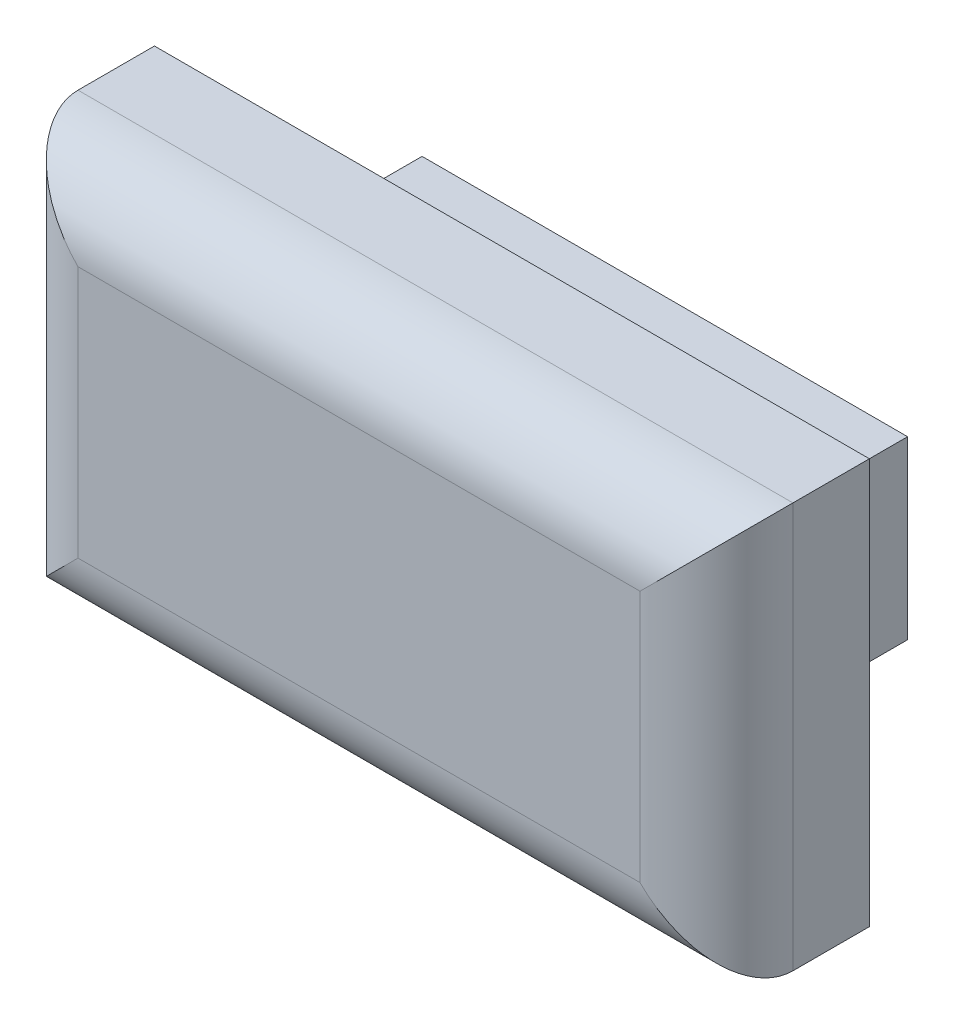
ISO-10303-21;
HEADER;
FILE_DESCRIPTION(('STEP AP214'),'2;1');
FILE_NAME('part.step','',(''),(''),'','','');
FILE_SCHEMA(('AUTOMOTIVE_DESIGN { 1 0 10303 214 1 1 1 1 }'));
ENDSEC;
DATA;
#1=APPLICATION_CONTEXT('core data for automotive mechanical design processes');
#2=APPLICATION_PROTOCOL_DEFINITION('international standard','automotive_design',2000,#1);
#3=PRODUCT_CONTEXT('',#1,'mechanical');
#4=PRODUCT('Part','Part','',(#3));
#5=PRODUCT_RELATED_PRODUCT_CATEGORY('part','',(#4));
#6=PRODUCT_DEFINITION_FORMATION('','',#4);
#7=PRODUCT_DEFINITION_CONTEXT('part definition',#1,'design');
#8=PRODUCT_DEFINITION('design','',#6,#7);
#9=PRODUCT_DEFINITION_SHAPE('','',#8);
#10=(LENGTH_UNIT() NAMED_UNIT(*) SI_UNIT(.MILLI.,.METRE.));
#11=(NAMED_UNIT(*) PLANE_ANGLE_UNIT() SI_UNIT($,.RADIAN.));
#12=(NAMED_UNIT(*) SI_UNIT($,.STERADIAN.) SOLID_ANGLE_UNIT());
#13=UNCERTAINTY_MEASURE_WITH_UNIT(LENGTH_MEASURE(1.E-05),#10,'distance_accuracy_value','');
#14=(GEOMETRIC_REPRESENTATION_CONTEXT(3) GLOBAL_UNCERTAINTY_ASSIGNED_CONTEXT((#13)) GLOBAL_UNIT_ASSIGNED_CONTEXT((#10,
#11,#12)) REPRESENTATION_CONTEXT('',''));
#15=CARTESIAN_POINT('',(0.,0.,0.));
#16=DIRECTION('',(0.,0.,1.));
#17=DIRECTION('',(1.,0.,0.));
#18=AXIS2_PLACEMENT_3D('',#15,#16,#17);
#19=CARTESIAN_POINT('',(-5.47959501557633,0.276947040498442,2.));
#20=DIRECTION('',(1.,0.,0.));
#21=DIRECTION('',(0.,0.,-1.));
#22=AXIS2_PLACEMENT_3D('',#19,#20,#21);
#23=PLANE('',#22);
#24=DIRECTION('',(0.,-1.,0.));
#25=VECTOR('',#24,1.);
#26=CARTESIAN_POINT('',(-5.47959501557633,0.276947040498442,0.));
#27=LINE('',#26,#25);
#28=CARTESIAN_POINT('',(-5.47959501557633,0.276947040498442,0.));
#29=VERTEX_POINT('',#28);
#30=CARTESIAN_POINT('',(-5.47959501557633,-2.02305295950156,0.));
#31=VERTEX_POINT('',#30);
#32=EDGE_CURVE('E130',#29,#31,#27,.T.);
#33=ORIENTED_EDGE('',*,*,#32,.T.);
#34=DIRECTION('',(0.,0.,-1.));
#35=VECTOR('',#34,1.);
#36=CARTESIAN_POINT('',(-5.47959501557633,-2.02305295950156,2.));
#37=LINE('',#36,#35);
#38=CARTESIAN_POINT('',(-5.47959501557633,-2.02305295950156,2.));
#39=VERTEX_POINT('',#38);
#40=EDGE_CURVE('E185',#39,#31,#37,.T.);
#41=ORIENTED_EDGE('',*,*,#40,.F.);
#42=DIRECTION('',(0.,-1.,0.));
#43=VECTOR('',#42,1.);
#44=CARTESIAN_POINT('',(-5.47959501557633,0.276947040498442,2.));
#45=LINE('',#44,#43);
#46=CARTESIAN_POINT('',(-5.47959501557633,0.276947040498442,2.));
#47=VERTEX_POINT('',#46);
#48=EDGE_CURVE('E153',#47,#39,#45,.T.);
#49=ORIENTED_EDGE('',*,*,#48,.F.);
#50=DIRECTION('',(0.,0.,-1.));
#51=VECTOR('',#50,1.);
#52=CARTESIAN_POINT('',(-5.47959501557633,0.276947040498442,2.));
#53=LINE('',#52,#51);
#54=EDGE_CURVE('E167',#47,#29,#53,.T.);
#55=ORIENTED_EDGE('',*,*,#54,.T.);
#56=EDGE_LOOP('',(#33,#41,#49,#55));
#57=FACE_BOUND('',#56,.T.);
#58=ADVANCED_FACE('F39',(#57),#23,.F.);
#59=CARTESIAN_POINT('',(-5.47959501557633,-2.02305295950156,2.));
#60=DIRECTION('',(0.,1.,0.));
#61=DIRECTION('',(0.,0.,1.));
#62=AXIS2_PLACEMENT_3D('',#59,#60,#61);
#63=PLANE('',#62);
#64=DIRECTION('',(1.,0.,0.));
#65=VECTOR('',#64,1.);
#66=CARTESIAN_POINT('',(-5.47959501557633,-2.02305295950156,0.));
#67=LINE('',#66,#65);
#68=CARTESIAN_POINT('',(0.870404984423674,-2.02305295950156,0.));
#69=VERTEX_POINT('',#68);
#70=EDGE_CURVE('E166',#31,#69,#67,.T.);
#71=ORIENTED_EDGE('',*,*,#70,.T.);
#72=DIRECTION('',(0.,0.,-1.));
#73=VECTOR('',#72,1.);
#74=CARTESIAN_POINT('',(0.870404984423674,-2.02305295950156,2.));
#75=LINE('',#74,#73);
#76=CARTESIAN_POINT('',(0.870404984423674,-2.02305295950156,2.));
#77=VERTEX_POINT('',#76);
#78=EDGE_CURVE('E176',#77,#69,#75,.T.);
#79=ORIENTED_EDGE('',*,*,#78,.F.);
#80=DIRECTION('',(1.,0.,0.));
#81=VECTOR('',#80,1.);
#82=CARTESIAN_POINT('',(-5.47959501557633,-2.02305295950156,2.));
#83=LINE('',#82,#81);
#84=EDGE_CURVE('E156',#39,#77,#83,.T.);
#85=ORIENTED_EDGE('',*,*,#84,.F.);
#86=ORIENTED_EDGE('',*,*,#40,.T.);
#87=EDGE_LOOP('',(#71,#79,#85,#86));
#88=FACE_BOUND('',#87,.T.);
#89=ADVANCED_FACE('F227',(#88),#63,.F.);
#90=CARTESIAN_POINT('',(0.870404984423674,0.276947040498442,2.));
#91=DIRECTION('',(-1.,0.,0.));
#92=DIRECTION('',(0.,-1.,0.));
#93=AXIS2_PLACEMENT_3D('',#90,#91,#92);
#94=PLANE('',#93);
#95=DIRECTION('',(0.,1.,0.));
#96=VECTOR('',#95,1.);
#97=CARTESIAN_POINT('',(0.870404984423674,0.276947040498442,0.));
#98=LINE('',#97,#96);
#99=CARTESIAN_POINT('',(0.870404984423674,0.276947040498442,0.));
#100=VERTEX_POINT('',#99);
#101=EDGE_CURVE('E171',#69,#100,#98,.T.);
#102=ORIENTED_EDGE('',*,*,#101,.T.);
#103=DIRECTION('',(0.,0.,-1.));
#104=VECTOR('',#103,1.);
#105=CARTESIAN_POINT('',(0.870404984423674,0.276947040498442,2.));
#106=LINE('',#105,#104);
#107=CARTESIAN_POINT('',(0.870404984423674,0.276947040498442,2.));
#108=VERTEX_POINT('',#107);
#109=EDGE_CURVE('E177',#108,#100,#106,.T.);
#110=ORIENTED_EDGE('',*,*,#109,.F.);
#111=DIRECTION('',(0.,1.,0.));
#112=VECTOR('',#111,1.);
#113=CARTESIAN_POINT('',(0.870404984423674,0.276947040498442,2.));
#114=LINE('',#113,#112);
#115=EDGE_CURVE('E159',#77,#108,#114,.T.);
#116=ORIENTED_EDGE('',*,*,#115,.F.);
#117=ORIENTED_EDGE('',*,*,#78,.T.);
#118=EDGE_LOOP('',(#102,#110,#116,#117));
#119=FACE_BOUND('',#118,.T.);
#120=ADVANCED_FACE('F233',(#119),#94,.F.);
#121=CARTESIAN_POINT('',(-5.47959501557633,0.276947040498442,2.));
#122=DIRECTION('',(0.,-1.,0.));
#123=DIRECTION('',(0.,0.,-1.));
#124=AXIS2_PLACEMENT_3D('',#121,#122,#123);
#125=PLANE('',#124);
#126=DIRECTION('',(-1.,0.,0.));
#127=VECTOR('',#126,1.);
#128=CARTESIAN_POINT('',(-5.47959501557633,0.276947040498442,0.));
#129=LINE('',#128,#127);
#130=EDGE_CURVE('E160',#100,#29,#129,.T.);
#131=ORIENTED_EDGE('',*,*,#130,.T.);
#132=ORIENTED_EDGE('',*,*,#54,.F.);
#133=DIRECTION('',(-1.,0.,0.));
#134=VECTOR('',#133,1.);
#135=CARTESIAN_POINT('',(-5.47959501557633,0.276947040498442,2.));
#136=LINE('',#135,#134);
#137=EDGE_CURVE('E162',#108,#47,#136,.T.);
#138=ORIENTED_EDGE('',*,*,#137,.F.);
#139=ORIENTED_EDGE('',*,*,#109,.T.);
#140=EDGE_LOOP('',(#131,#132,#138,#139));
#141=FACE_BOUND('',#140,.T.);
#142=ADVANCED_FACE('F263',(#141),#125,.F.);
#143=CARTESIAN_POINT('',(0.,0.,0.));
#144=DIRECTION('',(0.,0.,1.));
#145=DIRECTION('',(1.,0.,0.));
#146=AXIS2_PLACEMENT_3D('',#143,#144,#145);
#147=PLANE('',#146);
#148=ORIENTED_EDGE('',*,*,#32,.F.);
#149=ORIENTED_EDGE('',*,*,#130,.F.);
#150=ORIENTED_EDGE('',*,*,#101,.F.);
#151=ORIENTED_EDGE('',*,*,#70,.F.);
#152=EDGE_LOOP('',(#148,#149,#150,#151));
#153=FACE_BOUND('',#152,.T.);
#154=ADVANCED_FACE('F260',(#153),#147,.F.);
#155=CARTESIAN_POINT('',(0.,0.,2.));
#156=DIRECTION('',(0.,0.,1.));
#157=DIRECTION('',(1.,0.,0.));
#158=AXIS2_PLACEMENT_3D('',#155,#156,#157);
#159=PLANE('',#158);
#160=DIRECTION('',(0.,1.,0.));
#161=VECTOR('',#160,1.);
#162=CARTESIAN_POINT('',(2.37040498442367,-3.52305295950156,2.));
#163=LINE('',#162,#161);
#164=CARTESIAN_POINT('',(2.37040498442367,-3.52305295950156,2.));
#165=VERTEX_POINT('',#164);
#166=CARTESIAN_POINT('',(2.37040498442367,1.77694704049844,2.));
#167=VERTEX_POINT('',#166);
#168=EDGE_CURVE('E134',#165,#167,#163,.T.);
#169=ORIENTED_EDGE('',*,*,#168,.F.);
#170=DIRECTION('',(1.,0.,0.));
#171=VECTOR('',#170,1.);
#172=CARTESIAN_POINT('',(-6.97959501557633,-3.52305295950156,2.));
#173=LINE('',#172,#171);
#174=CARTESIAN_POINT('',(-6.97959501557633,-3.52305295950156,2.));
#175=VERTEX_POINT('',#174);
#176=EDGE_CURVE('E150',#175,#165,#173,.T.);
#177=ORIENTED_EDGE('',*,*,#176,.F.);
#178=DIRECTION('',(0.,-1.,0.));
#179=VECTOR('',#178,1.);
#180=CARTESIAN_POINT('',(-6.97959501557633,1.77694704049844,2.));
#181=LINE('',#180,#179);
#182=CARTESIAN_POINT('',(-6.97959501557633,1.77694704049844,2.));
#183=VERTEX_POINT('',#182);
#184=EDGE_CURVE('E139',#183,#175,#181,.T.);
#185=ORIENTED_EDGE('',*,*,#184,.F.);
#186=DIRECTION('',(-1.,0.,0.));
#187=VECTOR('',#186,1.);
#188=CARTESIAN_POINT('',(2.37040498442367,1.77694704049844,2.));
#189=LINE('',#188,#187);
#190=EDGE_CURVE('E119',#167,#183,#189,.T.);
#191=ORIENTED_EDGE('',*,*,#190,.F.);
#192=EDGE_LOOP('',(#169,#177,#185,#191));
#193=FACE_BOUND('',#192,.T.);
#194=ORIENTED_EDGE('',*,*,#137,.T.);
#195=ORIENTED_EDGE('',*,*,#48,.T.);
#196=ORIENTED_EDGE('',*,*,#84,.T.);
#197=ORIENTED_EDGE('',*,*,#115,.T.);
#198=EDGE_LOOP('',(#194,#195,#196,#197));
#199=FACE_BOUND('',#198,.T.);
#200=ADVANCED_FACE('F135',(#193,#199),#159,.F.);
#201=CARTESIAN_POINT('',(2.37040498442367,-3.52305295950156,4.));
#202=DIRECTION('',(-1.,0.,0.));
#203=DIRECTION('',(0.,0.,1.));
#204=AXIS2_PLACEMENT_3D('',#201,#202,#203);
#205=PLANE('',#204);
#206=DIRECTION('',(0.,0.,-1.));
#207=VECTOR('',#206,1.);
#208=CARTESIAN_POINT('',(2.37040498442367,1.77694704049844,4.));
#209=LINE('',#208,#207);
#210=CARTESIAN_POINT('',(2.37040498442367,1.77694704049844,3.));
#211=VERTEX_POINT('',#210);
#212=EDGE_CURVE('E120',#211,#167,#209,.T.);
#213=ORIENTED_EDGE('',*,*,#212,.F.);
#214=DIRECTION('',(0.,1.,0.));
#215=VECTOR('',#214,1.);
#216=CARTESIAN_POINT('',(2.37040498442367,-3.52305295950156,3.));
#217=LINE('',#216,#215);
#218=CARTESIAN_POINT('',(2.37040498442367,-3.52305295950156,3.));
#219=VERTEX_POINT('',#218);
#220=EDGE_CURVE('E191',#211,#219,#217,.F.);
#221=ORIENTED_EDGE('',*,*,#220,.T.);
#222=DIRECTION('',(0.,0.,-1.));
#223=VECTOR('',#222,1.);
#224=CARTESIAN_POINT('',(2.37040498442367,-3.52305295950156,4.));
#225=LINE('',#224,#223);
#226=EDGE_CURVE('E138',#219,#165,#225,.T.);
#227=ORIENTED_EDGE('',*,*,#226,.T.);
#228=ORIENTED_EDGE('',*,*,#168,.T.);
#229=EDGE_LOOP('',(#213,#221,#227,#228));
#230=FACE_BOUND('',#229,.T.);
#231=ADVANCED_FACE('F136',(#230),#205,.F.);
#232=CARTESIAN_POINT('',(2.37040498442367,1.77694704049844,4.));
#233=DIRECTION('',(0.,-1.,0.));
#234=DIRECTION('',(1.,0.,0.));
#235=AXIS2_PLACEMENT_3D('',#232,#233,#234);
#236=PLANE('',#235);
#237=DIRECTION('',(0.,0.,-1.));
#238=VECTOR('',#237,1.);
#239=CARTESIAN_POINT('',(-6.97959501557633,1.77694704049844,4.));
#240=LINE('',#239,#238);
#241=CARTESIAN_POINT('',(-6.97959501557633,1.77694704049844,3.));
#242=VERTEX_POINT('',#241);
#243=EDGE_CURVE('E126',#242,#183,#240,.T.);
#244=ORIENTED_EDGE('',*,*,#243,.F.);
#245=DIRECTION('',(-1.,0.,0.));
#246=VECTOR('',#245,1.);
#247=CARTESIAN_POINT('',(2.37040498442367,1.77694704049844,3.));
#248=LINE('',#247,#246);
#249=EDGE_CURVE('E11',#242,#211,#248,.F.);
#250=ORIENTED_EDGE('',*,*,#249,.T.);
#251=ORIENTED_EDGE('',*,*,#212,.T.);
#252=ORIENTED_EDGE('',*,*,#190,.T.);
#253=EDGE_LOOP('',(#244,#250,#251,#252));
#254=FACE_BOUND('',#253,.T.);
#255=ADVANCED_FACE('F118',(#254),#236,.F.);
#256=CARTESIAN_POINT('',(-6.97959501557633,1.77694704049844,4.));
#257=DIRECTION('',(1.,0.,0.));
#258=DIRECTION('',(0.,1.,0.));
#259=AXIS2_PLACEMENT_3D('',#256,#257,#258);
#260=PLANE('',#259);
#261=DIRECTION('',(0.,0.,-1.));
#262=VECTOR('',#261,1.);
#263=CARTESIAN_POINT('',(-6.97959501557633,-3.52305295950156,4.));
#264=LINE('',#263,#262);
#265=CARTESIAN_POINT('',(-6.97959501557633,-3.52305295950156,3.));
#266=VERTEX_POINT('',#265);
#267=EDGE_CURVE('E147',#266,#175,#264,.T.);
#268=ORIENTED_EDGE('',*,*,#267,.F.);
#269=DIRECTION('',(0.,-1.,0.));
#270=VECTOR('',#269,1.);
#271=CARTESIAN_POINT('',(-6.97959501557633,1.77694704049844,3.));
#272=LINE('',#271,#270);
#273=EDGE_CURVE('E48',#266,#242,#272,.F.);
#274=ORIENTED_EDGE('',*,*,#273,.T.);
#275=ORIENTED_EDGE('',*,*,#243,.T.);
#276=ORIENTED_EDGE('',*,*,#184,.T.);
#277=EDGE_LOOP('',(#268,#274,#275,#276));
#278=FACE_BOUND('',#277,.T.);
#279=ADVANCED_FACE('F217',(#278),#260,.F.);
#280=CARTESIAN_POINT('',(-6.97959501557633,-3.52305295950156,4.));
#281=DIRECTION('',(0.,1.,0.));
#282=DIRECTION('',(-1.,0.,0.));
#283=AXIS2_PLACEMENT_3D('',#280,#281,#282);
#284=PLANE('',#283);
#285=ORIENTED_EDGE('',*,*,#226,.F.);
#286=DIRECTION('',(1.,0.,0.));
#287=VECTOR('',#286,1.);
#288=CARTESIAN_POINT('',(-6.97959501557633,-3.52305295950156,3.));
#289=LINE('',#288,#287);
#290=EDGE_CURVE('E62',#219,#266,#289,.F.);
#291=ORIENTED_EDGE('',*,*,#290,.T.);
#292=ORIENTED_EDGE('',*,*,#267,.T.);
#293=ORIENTED_EDGE('',*,*,#176,.T.);
#294=EDGE_LOOP('',(#285,#291,#292,#293));
#295=FACE_BOUND('',#294,.T.);
#296=ADVANCED_FACE('F220',(#295),#284,.F.);
#297=CARTESIAN_POINT('',(0.,0.,4.));
#298=DIRECTION('',(0.,0.,1.));
#299=DIRECTION('',(1.,0.,0.));
#300=AXIS2_PLACEMENT_3D('',#297,#298,#299);
#301=PLANE('',#300);
#302=DIRECTION('',(1.,0.,0.));
#303=VECTOR('',#302,1.);
#304=CARTESIAN_POINT('',(2.37040498442367,-2.52305295950156,4.));
#305=LINE('',#304,#303);
#306=CARTESIAN_POINT('',(-5.97959501557633,-2.52305295950156,4.));
#307=VERTEX_POINT('',#306);
#308=CARTESIAN_POINT('',(1.37040498442367,-2.52305295950156,4.));
#309=VERTEX_POINT('',#308);
#310=EDGE_CURVE('E188',#307,#309,#305,.T.);
#311=ORIENTED_EDGE('',*,*,#310,.T.);
#312=DIRECTION('',(0.,1.,0.));
#313=VECTOR('',#312,1.);
#314=CARTESIAN_POINT('',(1.37040498442367,1.77694704049844,4.));
#315=LINE('',#314,#313);
#316=CARTESIAN_POINT('',(1.37040498442367,0.776947040498443,4.));
#317=VERTEX_POINT('',#316);
#318=EDGE_CURVE('E192',#309,#317,#315,.T.);
#319=ORIENTED_EDGE('',*,*,#318,.T.);
#320=DIRECTION('',(-1.,0.,0.));
#321=VECTOR('',#320,1.);
#322=CARTESIAN_POINT('',(-6.97959501557633,0.776947040498441,4.));
#323=LINE('',#322,#321);
#324=CARTESIAN_POINT('',(-5.97959501557633,0.776947040498442,4.));
#325=VERTEX_POINT('',#324);
#326=EDGE_CURVE('E183',#317,#325,#323,.T.);
#327=ORIENTED_EDGE('',*,*,#326,.T.);
#328=DIRECTION('',(0.,-1.,0.));
#329=VECTOR('',#328,1.);
#330=CARTESIAN_POINT('',(-5.97959501557633,-3.52305295950156,4.));
#331=LINE('',#330,#329);
#332=EDGE_CURVE('E190',#325,#307,#331,.T.);
#333=ORIENTED_EDGE('',*,*,#332,.T.);
#334=EDGE_LOOP('',(#311,#319,#327,#333));
#335=FACE_BOUND('',#334,.T.);
#336=ADVANCED_FACE('F215',(#335),#301,.T.);
#337=CARTESIAN_POINT('',(-5.97959501557633,0.,3.));
#338=DIRECTION('',(0.,1.,0.));
#339=DIRECTION('',(-1.,0.,0.));
#340=AXIS2_PLACEMENT_3D('',#337,#338,#339);
#341=CYLINDRICAL_SURFACE('',#340,1.);
#342=CARTESIAN_POINT('',(-5.97959501557633,0.776947040498442,3.));
#343=DIRECTION('',(0.707106781186547,0.707106781186548,0.));
#344=DIRECTION('',(0.707106781186548,-0.707106781186547,0.));
#345=AXIS2_PLACEMENT_3D('',#342,#343,#344);
#346=ELLIPSE('',#345,1.41421356237309,1.);
#347=EDGE_CURVE('E145',#242,#325,#346,.T.);
#348=ORIENTED_EDGE('',*,*,#347,.F.);
#349=ORIENTED_EDGE('',*,*,#273,.F.);
#350=CARTESIAN_POINT('',(-5.97959501557633,-2.52305295950156,3.));
#351=DIRECTION('',(-0.707106781186548,0.707106781186547,0.));
#352=DIRECTION('',(0.707106781186547,0.707106781186548,0.));
#353=AXIS2_PLACEMENT_3D('',#350,#351,#352);
#354=ELLIPSE('',#353,1.41421356237309,1.);
#355=EDGE_CURVE('E43',#307,#266,#354,.F.);
#356=ORIENTED_EDGE('',*,*,#355,.F.);
#357=ORIENTED_EDGE('',*,*,#332,.F.);
#358=EDGE_LOOP('',(#348,#349,#356,#357));
#359=FACE_BOUND('',#358,.T.);
#360=ADVANCED_FACE('F41',(#359),#341,.T.);
#361=CARTESIAN_POINT('',(0.,-2.52305295950156,3.));
#362=DIRECTION('',(-1.,0.,0.));
#363=DIRECTION('',(0.,-1.,0.));
#364=AXIS2_PLACEMENT_3D('',#361,#362,#363);
#365=CYLINDRICAL_SURFACE('',#364,1.);
#366=ORIENTED_EDGE('',*,*,#355,.T.);
#367=ORIENTED_EDGE('',*,*,#290,.F.);
#368=CARTESIAN_POINT('',(1.37040498442367,-2.52305295950156,3.));
#369=DIRECTION('',(-0.707106781186547,-0.707106781186547,0.));
#370=DIRECTION('',(-0.707106781186547,0.707106781186547,0.));
#371=AXIS2_PLACEMENT_3D('',#368,#369,#370);
#372=ELLIPSE('',#371,1.41421356237309,1.);
#373=EDGE_CURVE('E199',#309,#219,#372,.F.);
#374=ORIENTED_EDGE('',*,*,#373,.F.);
#375=ORIENTED_EDGE('',*,*,#310,.F.);
#376=EDGE_LOOP('',(#366,#367,#374,#375));
#377=FACE_BOUND('',#376,.T.);
#378=ADVANCED_FACE('F242',(#377),#365,.T.);
#379=CARTESIAN_POINT('',(0.,0.776947040498443,3.));
#380=DIRECTION('',(1.,0.,0.));
#381=DIRECTION('',(0.,1.,0.));
#382=AXIS2_PLACEMENT_3D('',#379,#380,#381);
#383=CYLINDRICAL_SURFACE('',#382,1.);
#384=ORIENTED_EDGE('',*,*,#347,.T.);
#385=ORIENTED_EDGE('',*,*,#326,.F.);
#386=CARTESIAN_POINT('',(1.37040498442367,0.776947040498443,3.));
#387=DIRECTION('',(0.707106781186548,-0.707106781186547,0.));
#388=DIRECTION('',(0.707106781186547,0.707106781186548,0.));
#389=AXIS2_PLACEMENT_3D('',#386,#387,#388);
#390=ELLIPSE('',#389,1.4142135623731,1.);
#391=EDGE_CURVE('E196',#211,#317,#390,.T.);
#392=ORIENTED_EDGE('',*,*,#391,.F.);
#393=ORIENTED_EDGE('',*,*,#249,.F.);
#394=EDGE_LOOP('',(#384,#385,#392,#393));
#395=FACE_BOUND('',#394,.T.);
#396=ADVANCED_FACE('F202',(#395),#383,.T.);
#397=CARTESIAN_POINT('',(1.37040498442367,0.,3.));
#398=DIRECTION('',(0.,-1.,0.));
#399=DIRECTION('',(0.,0.,-1.));
#400=AXIS2_PLACEMENT_3D('',#397,#398,#399);
#401=CYLINDRICAL_SURFACE('',#400,1.);
#402=ORIENTED_EDGE('',*,*,#373,.T.);
#403=ORIENTED_EDGE('',*,*,#220,.F.);
#404=ORIENTED_EDGE('',*,*,#391,.T.);
#405=ORIENTED_EDGE('',*,*,#318,.F.);
#406=EDGE_LOOP('',(#402,#403,#404,#405));
#407=FACE_BOUND('',#406,.T.);
#408=ADVANCED_FACE('F216',(#407),#401,.T.);
#409=CLOSED_SHELL('',(#58,#89,#120,#142,#154,#200,#231,#255,#279,#296,#336,#360,#378,#396,#408));
#410=MANIFOLD_SOLID_BREP('B2',#409);
#411=ADVANCED_BREP_SHAPE_REPRESENTATION('',(#18,#410),#14);
#412=SHAPE_DEFINITION_REPRESENTATION(#9,#411);
ENDSEC;
END-ISO-10303-21;
